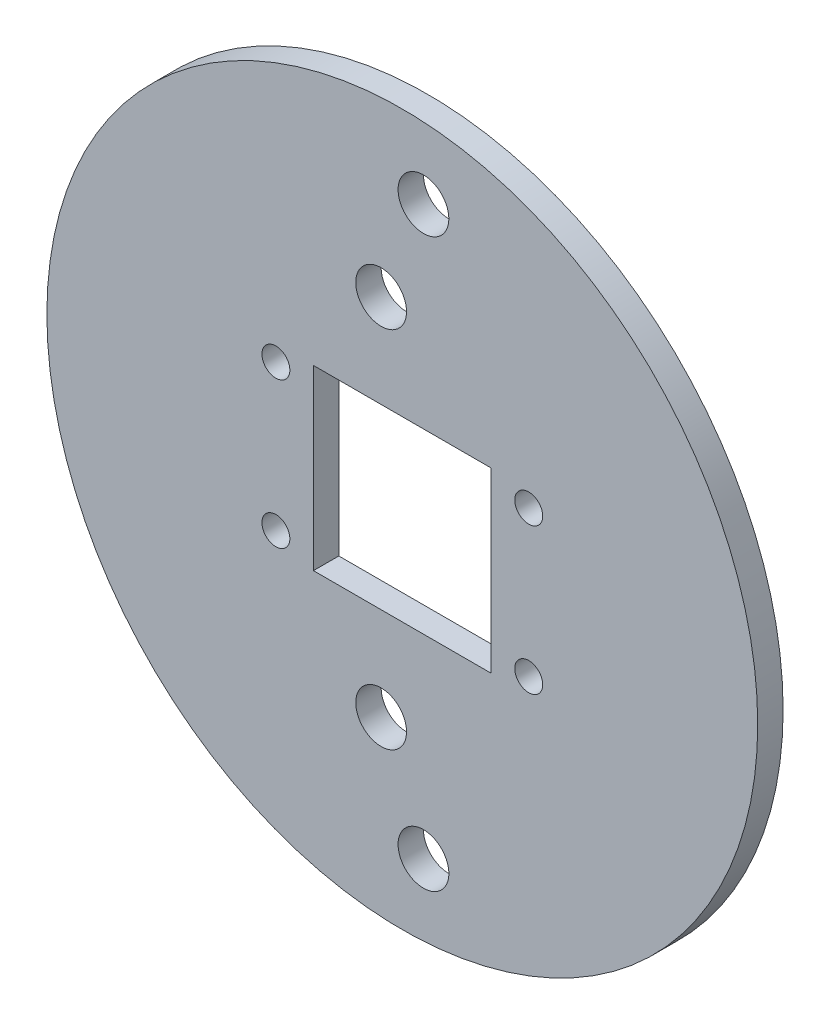
ISO-10303-21;
HEADER;
FILE_DESCRIPTION(('STEP AP214'),'2;1');
FILE_NAME('part.step','',(''),(''),'','','');
FILE_SCHEMA(('AUTOMOTIVE_DESIGN { 1 0 10303 214 1 1 1 1 }'));
ENDSEC;
DATA;
#1=APPLICATION_CONTEXT('core data for automotive mechanical design processes');
#2=APPLICATION_PROTOCOL_DEFINITION('international standard','automotive_design',2000,#1);
#3=PRODUCT_CONTEXT('',#1,'mechanical');
#4=PRODUCT('Part','Part','',(#3));
#5=PRODUCT_RELATED_PRODUCT_CATEGORY('part','',(#4));
#6=PRODUCT_DEFINITION_FORMATION('','',#4);
#7=PRODUCT_DEFINITION_CONTEXT('part definition',#1,'design');
#8=PRODUCT_DEFINITION('design','',#6,#7);
#9=PRODUCT_DEFINITION_SHAPE('','',#8);
#10=(LENGTH_UNIT() NAMED_UNIT(*) SI_UNIT(.MILLI.,.METRE.));
#11=(NAMED_UNIT(*) PLANE_ANGLE_UNIT() SI_UNIT($,.RADIAN.));
#12=(NAMED_UNIT(*) SI_UNIT($,.STERADIAN.) SOLID_ANGLE_UNIT());
#13=UNCERTAINTY_MEASURE_WITH_UNIT(LENGTH_MEASURE(1.E-05),#10,'distance_accuracy_value','');
#14=(GEOMETRIC_REPRESENTATION_CONTEXT(3) GLOBAL_UNCERTAINTY_ASSIGNED_CONTEXT((#13)) GLOBAL_UNIT_ASSIGNED_CONTEXT((#10,
#11,#12)) REPRESENTATION_CONTEXT('',''));
#15=CARTESIAN_POINT('',(0.,0.,0.));
#16=DIRECTION('',(0.,0.,1.));
#17=DIRECTION('',(1.,0.,0.));
#18=AXIS2_PLACEMENT_3D('',#15,#16,#17);
#19=CARTESIAN_POINT('',(0.,0.,3.));
#20=DIRECTION('',(0.,0.,1.));
#21=DIRECTION('',(1.,0.,0.));
#22=AXIS2_PLACEMENT_3D('',#19,#20,#21);
#23=PLANE('',#22);
#24=CARTESIAN_POINT('',(-2.5,-21.5,3.));
#25=DIRECTION('',(0.,0.,1.));
#26=DIRECTION('',(-1.,0.,0.));
#27=AXIS2_PLACEMENT_3D('',#24,#25,#26);
#28=CIRCLE('',#27,3.);
#29=CARTESIAN_POINT('',(-5.5,-21.5,3.));
#30=VERTEX_POINT('',#29);
#31=EDGE_CURVE('E149',#30,#30,#28,.T.);
#32=ORIENTED_EDGE('',*,*,#31,.F.);
#33=EDGE_LOOP('',(#32));
#34=FACE_BOUND('',#33,.T.);
#35=CARTESIAN_POINT('',(-14.9389382152815,8.62500000000018,3.));
#36=DIRECTION('',(0.,0.,1.));
#37=DIRECTION('',(1.,0.,0.));
#38=AXIS2_PLACEMENT_3D('',#35,#36,#37);
#39=CIRCLE('',#38,1.65);
#40=CARTESIAN_POINT('',(-13.2889382152815,8.62500000000018,3.));
#41=VERTEX_POINT('',#40);
#42=EDGE_CURVE('E153',#41,#41,#39,.T.);
#43=ORIENTED_EDGE('',*,*,#42,.F.);
#44=EDGE_LOOP('',(#43));
#45=FACE_BOUND('',#44,.T.);
#46=CARTESIAN_POINT('',(14.9389382152815,-8.62500000000007,3.));
#47=DIRECTION('',(0.,0.,1.));
#48=DIRECTION('',(1.,0.,0.));
#49=AXIS2_PLACEMENT_3D('',#46,#47,#48);
#50=CIRCLE('',#49,1.65);
#51=CARTESIAN_POINT('',(16.5889382152815,-8.62500000000007,3.));
#52=VERTEX_POINT('',#51);
#53=EDGE_CURVE('E156',#52,#52,#50,.T.);
#54=ORIENTED_EDGE('',*,*,#53,.F.);
#55=EDGE_LOOP('',(#54));
#56=FACE_BOUND('',#55,.T.);
#57=DIRECTION('',(-1.,0.,0.));
#58=VECTOR('',#57,1.);
#59=CARTESIAN_POINT('',(-10.5,10.5,3.));
#60=LINE('',#59,#58);
#61=CARTESIAN_POINT('',(10.5,10.5,3.));
#62=VERTEX_POINT('',#61);
#63=CARTESIAN_POINT('',(-10.5,10.5,3.));
#64=VERTEX_POINT('',#63);
#65=EDGE_CURVE('E90',#62,#64,#60,.T.);
#66=ORIENTED_EDGE('',*,*,#65,.F.);
#67=DIRECTION('',(0.,1.,0.));
#68=VECTOR('',#67,1.);
#69=CARTESIAN_POINT('',(10.5,10.5,3.));
#70=LINE('',#69,#68);
#71=CARTESIAN_POINT('',(10.5,-10.5,3.));
#72=VERTEX_POINT('',#71);
#73=EDGE_CURVE('E82',#72,#62,#70,.T.);
#74=ORIENTED_EDGE('',*,*,#73,.F.);
#75=DIRECTION('',(1.,0.,0.));
#76=VECTOR('',#75,1.);
#77=CARTESIAN_POINT('',(-10.5,-10.5,3.));
#78=LINE('',#77,#76);
#79=CARTESIAN_POINT('',(-10.5,-10.5,3.));
#80=VERTEX_POINT('',#79);
#81=EDGE_CURVE('E105',#80,#72,#78,.T.);
#82=ORIENTED_EDGE('',*,*,#81,.F.);
#83=DIRECTION('',(0.,-1.,0.));
#84=VECTOR('',#83,1.);
#85=CARTESIAN_POINT('',(-10.5,10.5,3.));
#86=LINE('',#85,#84);
#87=EDGE_CURVE('E103',#64,#80,#86,.T.);
#88=ORIENTED_EDGE('',*,*,#87,.F.);
#89=EDGE_LOOP('',(#66,#74,#82,#88));
#90=FACE_BOUND('',#89,.T.);
#91=CARTESIAN_POINT('',(-2.5,21.5,3.));
#92=DIRECTION('',(0.,0.,1.));
#93=DIRECTION('',(1.,0.,0.));
#94=AXIS2_PLACEMENT_3D('',#91,#92,#93);
#95=CIRCLE('',#94,3.);
#96=CARTESIAN_POINT('',(0.5,21.5,3.));
#97=VERTEX_POINT('',#96);
#98=EDGE_CURVE('E121',#97,#97,#95,.T.);
#99=ORIENTED_EDGE('',*,*,#98,.F.);
#100=EDGE_LOOP('',(#99));
#101=FACE_BOUND('',#100,.T.);
#102=CARTESIAN_POINT('',(0.,0.,3.));
#103=DIRECTION('',(0.,0.,1.));
#104=DIRECTION('',(1.,0.,0.));
#105=AXIS2_PLACEMENT_3D('',#102,#103,#104);
#106=CIRCLE('',#105,42.);
#107=CARTESIAN_POINT('',(42.,0.,3.));
#108=VERTEX_POINT('',#107);
#109=EDGE_CURVE('E11',#108,#108,#106,.T.);
#110=ORIENTED_EDGE('',*,*,#109,.T.);
#111=EDGE_LOOP('',(#110));
#112=FACE_BOUND('',#111,.T.);
#113=CARTESIAN_POINT('',(14.9389382152816,8.62499999999997,3.));
#114=DIRECTION('',(0.,0.,1.));
#115=DIRECTION('',(1.,0.,0.));
#116=AXIS2_PLACEMENT_3D('',#113,#114,#115);
#117=CIRCLE('',#116,1.65);
#118=CARTESIAN_POINT('',(16.5889382152816,8.62499999999997,3.));
#119=VERTEX_POINT('',#118);
#120=EDGE_CURVE('E111',#119,#119,#117,.T.);
#121=ORIENTED_EDGE('',*,*,#120,.F.);
#122=EDGE_LOOP('',(#121));
#123=FACE_BOUND('',#122,.T.);
#124=CARTESIAN_POINT('',(-14.9389382152816,-8.62499999999986,3.));
#125=DIRECTION('',(0.,0.,1.));
#126=DIRECTION('',(1.,0.,0.));
#127=AXIS2_PLACEMENT_3D('',#124,#125,#126);
#128=CIRCLE('',#127,1.65);
#129=CARTESIAN_POINT('',(-13.2889382152816,-8.62499999999986,3.));
#130=VERTEX_POINT('',#129);
#131=EDGE_CURVE('E163',#130,#130,#128,.T.);
#132=ORIENTED_EDGE('',*,*,#131,.F.);
#133=EDGE_LOOP('',(#132));
#134=FACE_BOUND('',#133,.T.);
#135=CARTESIAN_POINT('',(2.5,33.5,3.));
#136=DIRECTION('',(0.,0.,1.));
#137=DIRECTION('',(1.,0.,0.));
#138=AXIS2_PLACEMENT_3D('',#135,#136,#137);
#139=CIRCLE('',#138,3.);
#140=CARTESIAN_POINT('',(5.5,33.5,3.));
#141=VERTEX_POINT('',#140);
#142=EDGE_CURVE('E182',#141,#141,#139,.T.);
#143=ORIENTED_EDGE('',*,*,#142,.F.);
#144=EDGE_LOOP('',(#143));
#145=FACE_BOUND('',#144,.T.);
#146=CARTESIAN_POINT('',(2.5,-33.5,3.));
#147=DIRECTION('',(0.,0.,1.));
#148=DIRECTION('',(-1.,0.,0.));
#149=AXIS2_PLACEMENT_3D('',#146,#147,#148);
#150=CIRCLE('',#149,3.);
#151=CARTESIAN_POINT('',(-0.500000000000004,-33.5,3.));
#152=VERTEX_POINT('',#151);
#153=EDGE_CURVE('E185',#152,#152,#150,.T.);
#154=ORIENTED_EDGE('',*,*,#153,.F.);
#155=EDGE_LOOP('',(#154));
#156=FACE_BOUND('',#155,.T.);
#157=ADVANCED_FACE('F41',(#34,#45,#56,#90,#101,#112,#123,#134,#145,#156),#23,.T.);
#158=CARTESIAN_POINT('',(0.,0.,0.));
#159=DIRECTION('',(0.,0.,1.));
#160=DIRECTION('',(1.,0.,0.));
#161=AXIS2_PLACEMENT_3D('',#158,#159,#160);
#162=PLANE('',#161);
#163=CARTESIAN_POINT('',(-2.5,21.5,0.));
#164=DIRECTION('',(0.,0.,1.));
#165=DIRECTION('',(1.,0.,0.));
#166=AXIS2_PLACEMENT_3D('',#163,#164,#165);
#167=CIRCLE('',#166,3.);
#168=CARTESIAN_POINT('',(0.5,21.5,0.));
#169=VERTEX_POINT('',#168);
#170=EDGE_CURVE('E98',#169,#169,#167,.T.);
#171=ORIENTED_EDGE('',*,*,#170,.T.);
#172=EDGE_LOOP('',(#171));
#173=FACE_BOUND('',#172,.T.);
#174=CARTESIAN_POINT('',(0.,0.,0.));
#175=DIRECTION('',(0.,0.,1.));
#176=DIRECTION('',(1.,0.,0.));
#177=AXIS2_PLACEMENT_3D('',#174,#175,#176);
#178=CIRCLE('',#177,42.);
#179=CARTESIAN_POINT('',(42.,0.,0.));
#180=VERTEX_POINT('',#179);
#181=EDGE_CURVE('E45',#180,#180,#178,.T.);
#182=ORIENTED_EDGE('',*,*,#181,.F.);
#183=EDGE_LOOP('',(#182));
#184=FACE_BOUND('',#183,.T.);
#185=DIRECTION('',(0.,1.,0.));
#186=VECTOR('',#185,1.);
#187=CARTESIAN_POINT('',(10.5,10.5,0.));
#188=LINE('',#187,#186);
#189=CARTESIAN_POINT('',(10.5,-10.5,0.));
#190=VERTEX_POINT('',#189);
#191=CARTESIAN_POINT('',(10.5,10.5,0.));
#192=VERTEX_POINT('',#191);
#193=EDGE_CURVE('E64',#190,#192,#188,.T.);
#194=ORIENTED_EDGE('',*,*,#193,.T.);
#195=DIRECTION('',(-1.,0.,0.));
#196=VECTOR('',#195,1.);
#197=CARTESIAN_POINT('',(-10.5,10.5,0.));
#198=LINE('',#197,#196);
#199=CARTESIAN_POINT('',(-10.5,10.5,0.));
#200=VERTEX_POINT('',#199);
#201=EDGE_CURVE('E97',#192,#200,#198,.T.);
#202=ORIENTED_EDGE('',*,*,#201,.T.);
#203=DIRECTION('',(0.,-1.,0.));
#204=VECTOR('',#203,1.);
#205=CARTESIAN_POINT('',(-10.5,10.5,0.));
#206=LINE('',#205,#204);
#207=CARTESIAN_POINT('',(-10.5,-10.5,0.));
#208=VERTEX_POINT('',#207);
#209=EDGE_CURVE('E113',#200,#208,#206,.T.);
#210=ORIENTED_EDGE('',*,*,#209,.T.);
#211=DIRECTION('',(1.,0.,0.));
#212=VECTOR('',#211,1.);
#213=CARTESIAN_POINT('',(-10.5,-10.5,0.));
#214=LINE('',#213,#212);
#215=EDGE_CURVE('E91',#208,#190,#214,.T.);
#216=ORIENTED_EDGE('',*,*,#215,.T.);
#217=EDGE_LOOP('',(#194,#202,#210,#216));
#218=FACE_BOUND('',#217,.T.);
#219=CARTESIAN_POINT('',(14.9389382152816,8.62499999999997,0.));
#220=DIRECTION('',(0.,0.,1.));
#221=DIRECTION('',(1.,0.,0.));
#222=AXIS2_PLACEMENT_3D('',#219,#220,#221);
#223=CIRCLE('',#222,1.65);
#224=CARTESIAN_POINT('',(16.5889382152816,8.62499999999997,0.));
#225=VERTEX_POINT('',#224);
#226=EDGE_CURVE('E158',#225,#225,#223,.T.);
#227=ORIENTED_EDGE('',*,*,#226,.T.);
#228=EDGE_LOOP('',(#227));
#229=FACE_BOUND('',#228,.T.);
#230=CARTESIAN_POINT('',(14.9389382152815,-8.62500000000007,0.));
#231=DIRECTION('',(0.,0.,1.));
#232=DIRECTION('',(1.,0.,0.));
#233=AXIS2_PLACEMENT_3D('',#230,#231,#232);
#234=CIRCLE('',#233,1.65);
#235=CARTESIAN_POINT('',(16.5889382152815,-8.62500000000007,0.));
#236=VERTEX_POINT('',#235);
#237=EDGE_CURVE('E159',#236,#236,#234,.T.);
#238=ORIENTED_EDGE('',*,*,#237,.T.);
#239=EDGE_LOOP('',(#238));
#240=FACE_BOUND('',#239,.T.);
#241=CARTESIAN_POINT('',(-14.9389382152816,-8.62499999999986,0.));
#242=DIRECTION('',(0.,0.,1.));
#243=DIRECTION('',(1.,0.,0.));
#244=AXIS2_PLACEMENT_3D('',#241,#242,#243);
#245=CIRCLE('',#244,1.65);
#246=CARTESIAN_POINT('',(-13.2889382152816,-8.62499999999986,0.));
#247=VERTEX_POINT('',#246);
#248=EDGE_CURVE('E166',#247,#247,#245,.T.);
#249=ORIENTED_EDGE('',*,*,#248,.T.);
#250=EDGE_LOOP('',(#249));
#251=FACE_BOUND('',#250,.T.);
#252=CARTESIAN_POINT('',(-14.9389382152815,8.62500000000018,0.));
#253=DIRECTION('',(0.,0.,1.));
#254=DIRECTION('',(1.,0.,0.));
#255=AXIS2_PLACEMENT_3D('',#252,#253,#254);
#256=CIRCLE('',#255,1.65);
#257=CARTESIAN_POINT('',(-13.2889382152815,8.62500000000018,0.));
#258=VERTEX_POINT('',#257);
#259=EDGE_CURVE('E198',#258,#258,#256,.T.);
#260=ORIENTED_EDGE('',*,*,#259,.T.);
#261=EDGE_LOOP('',(#260));
#262=FACE_BOUND('',#261,.T.);
#263=CARTESIAN_POINT('',(2.5,33.5,0.));
#264=DIRECTION('',(0.,0.,1.));
#265=DIRECTION('',(1.,0.,0.));
#266=AXIS2_PLACEMENT_3D('',#263,#264,#265);
#267=CIRCLE('',#266,3.);
#268=CARTESIAN_POINT('',(5.5,33.5,0.));
#269=VERTEX_POINT('',#268);
#270=EDGE_CURVE('E195',#269,#269,#267,.T.);
#271=ORIENTED_EDGE('',*,*,#270,.T.);
#272=EDGE_LOOP('',(#271));
#273=FACE_BOUND('',#272,.T.);
#274=CARTESIAN_POINT('',(-2.5,-21.5,0.));
#275=DIRECTION('',(0.,0.,1.));
#276=DIRECTION('',(-1.,0.,0.));
#277=AXIS2_PLACEMENT_3D('',#274,#275,#276);
#278=CIRCLE('',#277,3.);
#279=CARTESIAN_POINT('',(-5.5,-21.5,0.));
#280=VERTEX_POINT('',#279);
#281=EDGE_CURVE('E187',#280,#280,#278,.T.);
#282=ORIENTED_EDGE('',*,*,#281,.T.);
#283=EDGE_LOOP('',(#282));
#284=FACE_BOUND('',#283,.T.);
#285=CARTESIAN_POINT('',(2.5,-33.5,0.));
#286=DIRECTION('',(0.,0.,1.));
#287=DIRECTION('',(-1.,0.,0.));
#288=AXIS2_PLACEMENT_3D('',#285,#286,#287);
#289=CIRCLE('',#288,3.);
#290=CARTESIAN_POINT('',(-0.500000000000004,-33.5,0.));
#291=VERTEX_POINT('',#290);
#292=EDGE_CURVE('E188',#291,#291,#289,.T.);
#293=ORIENTED_EDGE('',*,*,#292,.T.);
#294=EDGE_LOOP('',(#293));
#295=FACE_BOUND('',#294,.T.);
#296=ADVANCED_FACE('F127',(#173,#184,#218,#229,#240,#251,#262,#273,#284,#295),#162,.F.);
#297=CARTESIAN_POINT('',(0.,0.,3.));
#298=DIRECTION('',(0.,0.,-1.));
#299=DIRECTION('',(-1.,0.,0.));
#300=AXIS2_PLACEMENT_3D('',#297,#298,#299);
#301=CYLINDRICAL_SURFACE('',#300,42.);
#302=ORIENTED_EDGE('',*,*,#109,.F.);
#303=EDGE_LOOP('',(#302));
#304=FACE_BOUND('',#303,.T.);
#305=ORIENTED_EDGE('',*,*,#181,.T.);
#306=EDGE_LOOP('',(#305));
#307=FACE_BOUND('',#306,.T.);
#308=ADVANCED_FACE('F43',(#304,#307),#301,.T.);
#309=CARTESIAN_POINT('',(-2.5,21.5,3.));
#310=DIRECTION('',(0.,0.,-1.));
#311=DIRECTION('',(-1.,0.,0.));
#312=AXIS2_PLACEMENT_3D('',#309,#310,#311);
#313=CYLINDRICAL_SURFACE('',#312,3.);
#314=ORIENTED_EDGE('',*,*,#98,.T.);
#315=EDGE_LOOP('',(#314));
#316=FACE_BOUND('',#315,.T.);
#317=ORIENTED_EDGE('',*,*,#170,.F.);
#318=EDGE_LOOP('',(#317));
#319=FACE_BOUND('',#318,.T.);
#320=ADVANCED_FACE('F130',(#316,#319),#313,.F.);
#321=CARTESIAN_POINT('',(10.5,10.5,3.));
#322=DIRECTION('',(-1.,0.,0.));
#323=DIRECTION('',(0.,-1.,0.));
#324=AXIS2_PLACEMENT_3D('',#321,#322,#323);
#325=PLANE('',#324);
#326=ORIENTED_EDGE('',*,*,#193,.F.);
#327=DIRECTION('',(0.,0.,-1.));
#328=VECTOR('',#327,1.);
#329=CARTESIAN_POINT('',(10.5,-10.5,3.));
#330=LINE('',#329,#328);
#331=EDGE_CURVE('E86',#72,#190,#330,.T.);
#332=ORIENTED_EDGE('',*,*,#331,.F.);
#333=ORIENTED_EDGE('',*,*,#73,.T.);
#334=DIRECTION('',(0.,0.,-1.));
#335=VECTOR('',#334,1.);
#336=CARTESIAN_POINT('',(10.5,10.5,3.));
#337=LINE('',#336,#335);
#338=EDGE_CURVE('E85',#62,#192,#337,.T.);
#339=ORIENTED_EDGE('',*,*,#338,.T.);
#340=EDGE_LOOP('',(#326,#332,#333,#339));
#341=FACE_BOUND('',#340,.T.);
#342=ADVANCED_FACE('F84',(#341),#325,.T.);
#343=CARTESIAN_POINT('',(-10.5,10.5,3.));
#344=DIRECTION('',(0.,-1.,0.));
#345=DIRECTION('',(0.,0.,-1.));
#346=AXIS2_PLACEMENT_3D('',#343,#344,#345);
#347=PLANE('',#346);
#348=ORIENTED_EDGE('',*,*,#201,.F.);
#349=ORIENTED_EDGE('',*,*,#338,.F.);
#350=ORIENTED_EDGE('',*,*,#65,.T.);
#351=DIRECTION('',(0.,0.,-1.));
#352=VECTOR('',#351,1.);
#353=CARTESIAN_POINT('',(-10.5,10.5,3.));
#354=LINE('',#353,#352);
#355=EDGE_CURVE('E99',#64,#200,#354,.T.);
#356=ORIENTED_EDGE('',*,*,#355,.T.);
#357=EDGE_LOOP('',(#348,#349,#350,#356));
#358=FACE_BOUND('',#357,.T.);
#359=ADVANCED_FACE('F94',(#358),#347,.T.);
#360=CARTESIAN_POINT('',(-10.5,10.5,3.));
#361=DIRECTION('',(1.,0.,0.));
#362=DIRECTION('',(0.,1.,0.));
#363=AXIS2_PLACEMENT_3D('',#360,#361,#362);
#364=PLANE('',#363);
#365=ORIENTED_EDGE('',*,*,#209,.F.);
#366=ORIENTED_EDGE('',*,*,#355,.F.);
#367=ORIENTED_EDGE('',*,*,#87,.T.);
#368=DIRECTION('',(0.,0.,-1.));
#369=VECTOR('',#368,1.);
#370=CARTESIAN_POINT('',(-10.5,-10.5,3.));
#371=LINE('',#370,#369);
#372=EDGE_CURVE('E56',#80,#208,#371,.T.);
#373=ORIENTED_EDGE('',*,*,#372,.T.);
#374=EDGE_LOOP('',(#365,#366,#367,#373));
#375=FACE_BOUND('',#374,.T.);
#376=ADVANCED_FACE('F229',(#375),#364,.T.);
#377=CARTESIAN_POINT('',(-10.5,-10.5,3.));
#378=DIRECTION('',(0.,1.,0.));
#379=DIRECTION('',(0.,0.,1.));
#380=AXIS2_PLACEMENT_3D('',#377,#378,#379);
#381=PLANE('',#380);
#382=ORIENTED_EDGE('',*,*,#215,.F.);
#383=ORIENTED_EDGE('',*,*,#372,.F.);
#384=ORIENTED_EDGE('',*,*,#81,.T.);
#385=ORIENTED_EDGE('',*,*,#331,.T.);
#386=EDGE_LOOP('',(#382,#383,#384,#385));
#387=FACE_BOUND('',#386,.T.);
#388=ADVANCED_FACE('F226',(#387),#381,.T.);
#389=CARTESIAN_POINT('',(14.9389382152816,8.62499999999997,3.));
#390=DIRECTION('',(0.,0.,-1.));
#391=DIRECTION('',(-1.,0.,0.));
#392=AXIS2_PLACEMENT_3D('',#389,#390,#391);
#393=CYLINDRICAL_SURFACE('',#392,1.65);
#394=ORIENTED_EDGE('',*,*,#120,.T.);
#395=EDGE_LOOP('',(#394));
#396=FACE_BOUND('',#395,.T.);
#397=ORIENTED_EDGE('',*,*,#226,.F.);
#398=EDGE_LOOP('',(#397));
#399=FACE_BOUND('',#398,.T.);
#400=ADVANCED_FACE('F172',(#396,#399),#393,.F.);
#401=CARTESIAN_POINT('',(14.9389382152815,-8.62500000000007,3.));
#402=DIRECTION('',(0.,0.,-1.));
#403=DIRECTION('',(-1.,0.,0.));
#404=AXIS2_PLACEMENT_3D('',#401,#402,#403);
#405=CYLINDRICAL_SURFACE('',#404,1.65);
#406=ORIENTED_EDGE('',*,*,#53,.T.);
#407=EDGE_LOOP('',(#406));
#408=FACE_BOUND('',#407,.T.);
#409=ORIENTED_EDGE('',*,*,#237,.F.);
#410=EDGE_LOOP('',(#409));
#411=FACE_BOUND('',#410,.T.);
#412=ADVANCED_FACE('F212',(#408,#411),#405,.F.);
#413=CARTESIAN_POINT('',(-14.9389382152816,-8.62499999999986,3.));
#414=DIRECTION('',(0.,0.,-1.));
#415=DIRECTION('',(-1.,0.,0.));
#416=AXIS2_PLACEMENT_3D('',#413,#414,#415);
#417=CYLINDRICAL_SURFACE('',#416,1.65);
#418=ORIENTED_EDGE('',*,*,#131,.T.);
#419=EDGE_LOOP('',(#418));
#420=FACE_BOUND('',#419,.T.);
#421=ORIENTED_EDGE('',*,*,#248,.F.);
#422=EDGE_LOOP('',(#421));
#423=FACE_BOUND('',#422,.T.);
#424=ADVANCED_FACE('F209',(#420,#423),#417,.F.);
#425=CARTESIAN_POINT('',(-14.9389382152815,8.62500000000018,3.));
#426=DIRECTION('',(0.,0.,-1.));
#427=DIRECTION('',(-1.,0.,0.));
#428=AXIS2_PLACEMENT_3D('',#425,#426,#427);
#429=CYLINDRICAL_SURFACE('',#428,1.65);
#430=ORIENTED_EDGE('',*,*,#42,.T.);
#431=EDGE_LOOP('',(#430));
#432=FACE_BOUND('',#431,.T.);
#433=ORIENTED_EDGE('',*,*,#259,.F.);
#434=EDGE_LOOP('',(#433));
#435=FACE_BOUND('',#434,.T.);
#436=ADVANCED_FACE('F211',(#432,#435),#429,.F.);
#437=CARTESIAN_POINT('',(2.5,33.5,3.));
#438=DIRECTION('',(0.,0.,-1.));
#439=DIRECTION('',(-1.,0.,0.));
#440=AXIS2_PLACEMENT_3D('',#437,#438,#439);
#441=CYLINDRICAL_SURFACE('',#440,3.);
#442=ORIENTED_EDGE('',*,*,#142,.T.);
#443=EDGE_LOOP('',(#442));
#444=FACE_BOUND('',#443,.T.);
#445=ORIENTED_EDGE('',*,*,#270,.F.);
#446=EDGE_LOOP('',(#445));
#447=FACE_BOUND('',#446,.T.);
#448=ADVANCED_FACE('F218',(#444,#447),#441,.F.);
#449=CARTESIAN_POINT('',(-2.5,-21.5,3.));
#450=DIRECTION('',(0.,0.,-1.));
#451=DIRECTION('',(-1.,0.,0.));
#452=AXIS2_PLACEMENT_3D('',#449,#450,#451);
#453=CYLINDRICAL_SURFACE('',#452,3.);
#454=ORIENTED_EDGE('',*,*,#31,.T.);
#455=EDGE_LOOP('',(#454));
#456=FACE_BOUND('',#455,.T.);
#457=ORIENTED_EDGE('',*,*,#281,.F.);
#458=EDGE_LOOP('',(#457));
#459=FACE_BOUND('',#458,.T.);
#460=ADVANCED_FACE('F278',(#456,#459),#453,.F.);
#461=CARTESIAN_POINT('',(2.5,-33.5,3.));
#462=DIRECTION('',(0.,0.,-1.));
#463=DIRECTION('',(-1.,0.,0.));
#464=AXIS2_PLACEMENT_3D('',#461,#462,#463);
#465=CYLINDRICAL_SURFACE('',#464,3.);
#466=ORIENTED_EDGE('',*,*,#153,.T.);
#467=EDGE_LOOP('',(#466));
#468=FACE_BOUND('',#467,.T.);
#469=ORIENTED_EDGE('',*,*,#292,.F.);
#470=EDGE_LOOP('',(#469));
#471=FACE_BOUND('',#470,.T.);
#472=ADVANCED_FACE('F287',(#468,#471),#465,.F.);
#473=CLOSED_SHELL('',(#157,#296,#308,#320,#342,#359,#376,#388,#400,#412,#424,#436,#448,#460,#472));
#474=MANIFOLD_SOLID_BREP('B2',#473);
#475=ADVANCED_BREP_SHAPE_REPRESENTATION('',(#18,#474),#14);
#476=SHAPE_DEFINITION_REPRESENTATION(#9,#475);
ENDSEC;
END-ISO-10303-21;
